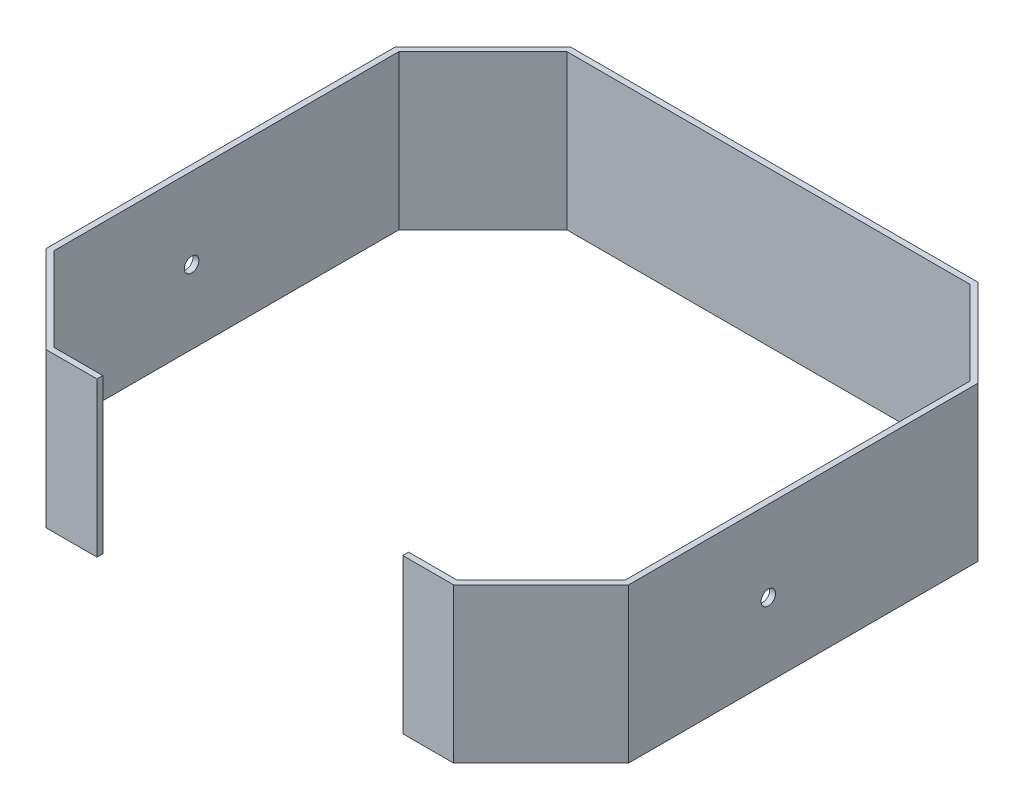
ISO-10303-21;
HEADER;
FILE_DESCRIPTION(('STEP AP214'),'2;1');
FILE_NAME('part.step','',(''),(''),'','','');
FILE_SCHEMA(('AUTOMOTIVE_DESIGN { 1 0 10303 214 1 1 1 1 }'));
ENDSEC;
DATA;
#1=APPLICATION_CONTEXT('core data for automotive mechanical design processes');
#2=APPLICATION_PROTOCOL_DEFINITION('international standard','automotive_design',2000,#1);
#3=PRODUCT_CONTEXT('',#1,'mechanical');
#4=PRODUCT('Part','Part','',(#3));
#5=PRODUCT_RELATED_PRODUCT_CATEGORY('part','',(#4));
#6=PRODUCT_DEFINITION_FORMATION('','',#4);
#7=PRODUCT_DEFINITION_CONTEXT('part definition',#1,'design');
#8=PRODUCT_DEFINITION('design','',#6,#7);
#9=PRODUCT_DEFINITION_SHAPE('','',#8);
#10=(LENGTH_UNIT() NAMED_UNIT(*) SI_UNIT(.MILLI.,.METRE.));
#11=(NAMED_UNIT(*) PLANE_ANGLE_UNIT() SI_UNIT($,.RADIAN.));
#12=(NAMED_UNIT(*) SI_UNIT($,.STERADIAN.) SOLID_ANGLE_UNIT());
#13=UNCERTAINTY_MEASURE_WITH_UNIT(LENGTH_MEASURE(1.E-05),#10,'distance_accuracy_value','');
#14=(GEOMETRIC_REPRESENTATION_CONTEXT(3) GLOBAL_UNCERTAINTY_ASSIGNED_CONTEXT((#13)) GLOBAL_UNIT_ASSIGNED_CONTEXT((#10,
#11,#12)) REPRESENTATION_CONTEXT('',''));
#15=CARTESIAN_POINT('',(0.,0.,0.));
#16=DIRECTION('',(0.,0.,1.));
#17=DIRECTION('',(1.,0.,0.));
#18=AXIS2_PLACEMENT_3D('',#15,#16,#17);
#19=CARTESIAN_POINT('',(-100.,26.5,90.));
#20=DIRECTION('',(0.,0.,-1.));
#21=DIRECTION('',(-1.,0.,0.));
#22=AXIS2_PLACEMENT_3D('',#19,#20,#21);
#23=PLANE('',#22);
#24=DIRECTION('',(1.,0.,0.));
#25=VECTOR('',#24,1.);
#26=CARTESIAN_POINT('',(-100.,-26.5,90.));
#27=LINE('',#26,#25);
#28=CARTESIAN_POINT('',(-70.,-26.5,90.));
#29=VERTEX_POINT('',#28);
#30=CARTESIAN_POINT('',(-52.5,-26.5,90.));
#31=VERTEX_POINT('',#30);
#32=EDGE_CURVE('E218',#29,#31,#27,.T.);
#33=ORIENTED_EDGE('',*,*,#32,.T.);
#34=DIRECTION('',(0.,-1.,0.));
#35=VECTOR('',#34,1.);
#36=CARTESIAN_POINT('',(-52.5,-26.5,90.));
#37=LINE('',#36,#35);
#38=CARTESIAN_POINT('',(-52.5,26.5,90.));
#39=VERTEX_POINT('',#38);
#40=EDGE_CURVE('E195',#39,#31,#37,.T.);
#41=ORIENTED_EDGE('',*,*,#40,.F.);
#42=DIRECTION('',(1.,0.,0.));
#43=VECTOR('',#42,1.);
#44=CARTESIAN_POINT('',(-100.,26.5,90.));
#45=LINE('',#44,#43);
#46=CARTESIAN_POINT('',(-70.,26.5,90.));
#47=VERTEX_POINT('',#46);
#48=EDGE_CURVE('E194',#47,#39,#45,.T.);
#49=ORIENTED_EDGE('',*,*,#48,.F.);
#50=DIRECTION('',(0.,-1.,0.));
#51=VECTOR('',#50,1.);
#52=CARTESIAN_POINT('',(-70.,26.5,90.));
#53=LINE('',#52,#51);
#54=EDGE_CURVE('E52',#47,#29,#53,.T.);
#55=ORIENTED_EDGE('',*,*,#54,.T.);
#56=EDGE_LOOP('',(#33,#41,#49,#55));
#57=FACE_BOUND('',#56,.T.);
#58=ADVANCED_FACE('F43',(#57),#23,.F.);
#59=CARTESIAN_POINT('',(-100.,26.5,88.));
#60=DIRECTION('',(0.,0.,-1.));
#61=DIRECTION('',(-1.,0.,0.));
#62=AXIS2_PLACEMENT_3D('',#59,#60,#61);
#63=PLANE('',#62);
#64=DIRECTION('',(0.,-1.,0.));
#65=VECTOR('',#64,1.);
#66=CARTESIAN_POINT('',(-52.5,-26.5,88.));
#67=LINE('',#66,#65);
#68=CARTESIAN_POINT('',(-52.5,26.5,88.));
#69=VERTEX_POINT('',#68);
#70=CARTESIAN_POINT('',(-52.5,-26.5,88.));
#71=VERTEX_POINT('',#70);
#72=EDGE_CURVE('E178',#69,#71,#67,.T.);
#73=ORIENTED_EDGE('',*,*,#72,.T.);
#74=DIRECTION('',(1.,0.,0.));
#75=VECTOR('',#74,1.);
#76=CARTESIAN_POINT('',(0.,-26.5,88.));
#77=LINE('',#76,#75);
#78=CARTESIAN_POINT('',(-69.1715728752538,-26.5,88.));
#79=VERTEX_POINT('',#78);
#80=EDGE_CURVE('E280',#79,#71,#77,.T.);
#81=ORIENTED_EDGE('',*,*,#80,.F.);
#82=DIRECTION('',(0.,1.,0.));
#83=VECTOR('',#82,1.);
#84=CARTESIAN_POINT('',(-69.1715728752538,26.5,88.));
#85=LINE('',#84,#83);
#86=CARTESIAN_POINT('',(-69.1715728752538,26.5,88.));
#87=VERTEX_POINT('',#86);
#88=EDGE_CURVE('E200',#87,#79,#85,.F.);
#89=ORIENTED_EDGE('',*,*,#88,.F.);
#90=DIRECTION('',(1.,0.,0.));
#91=VECTOR('',#90,1.);
#92=CARTESIAN_POINT('',(0.,26.5,88.));
#93=LINE('',#92,#91);
#94=EDGE_CURVE('E192',#87,#69,#93,.T.);
#95=ORIENTED_EDGE('',*,*,#94,.T.);
#96=EDGE_LOOP('',(#73,#81,#89,#95));
#97=FACE_BOUND('',#96,.T.);
#98=ADVANCED_FACE('F198',(#97),#63,.T.);
#99=CARTESIAN_POINT('',(0.,26.5,0.));
#100=DIRECTION('',(0.,-1.,0.));
#101=DIRECTION('',(0.,0.,-1.));
#102=AXIS2_PLACEMENT_3D('',#99,#100,#101);
#103=PLANE('',#102);
#104=ORIENTED_EDGE('',*,*,#48,.T.);
#105=DIRECTION('',(0.,0.,1.));
#106=VECTOR('',#105,1.);
#107=CARTESIAN_POINT('',(-52.5,26.5,-29.618025829377));
#108=LINE('',#107,#106);
#109=EDGE_CURVE('E181',#69,#39,#108,.T.);
#110=ORIENTED_EDGE('',*,*,#109,.F.);
#111=ORIENTED_EDGE('',*,*,#94,.F.);
#112=DIRECTION('',(-0.707106781186546,0.,-0.707106781186549));
#113=VECTOR('',#112,1.);
#114=CARTESIAN_POINT('',(-68.5857864376269,26.5,88.5857864376269));
#115=LINE('',#114,#113);
#116=CARTESIAN_POINT('',(-98.,26.5,59.1715728752537));
#117=VERTEX_POINT('',#116);
#118=EDGE_CURVE('E209',#117,#87,#115,.F.);
#119=ORIENTED_EDGE('',*,*,#118,.F.);
#120=DIRECTION('',(0.,0.,1.));
#121=VECTOR('',#120,1.);
#122=CARTESIAN_POINT('',(-98.,26.5,0.));
#123=LINE('',#122,#121);
#124=CARTESIAN_POINT('',(-98.,26.5,-59.1715728752538));
#125=VERTEX_POINT('',#124);
#126=EDGE_CURVE('E206',#125,#117,#123,.T.);
#127=ORIENTED_EDGE('',*,*,#126,.F.);
#128=DIRECTION('',(0.707106781186549,0.,-0.707106781186546));
#129=VECTOR('',#128,1.);
#130=CARTESIAN_POINT('',(-98.5857864376269,26.5,-58.5857864376269));
#131=LINE('',#130,#129);
#132=CARTESIAN_POINT('',(-69.1715728752538,26.5,-88.));
#133=VERTEX_POINT('',#132);
#134=EDGE_CURVE('E293',#133,#125,#131,.F.);
#135=ORIENTED_EDGE('',*,*,#134,.F.);
#136=DIRECTION('',(-1.,0.,0.));
#137=VECTOR('',#136,1.);
#138=CARTESIAN_POINT('',(0.,26.5,-88.));
#139=LINE('',#138,#137);
#140=CARTESIAN_POINT('',(69.1715728752538,26.5,-88.));
#141=VERTEX_POINT('',#140);
#142=EDGE_CURVE('E323',#141,#133,#139,.T.);
#143=ORIENTED_EDGE('',*,*,#142,.F.);
#144=DIRECTION('',(0.707106781186546,0.,0.707106781186549));
#145=VECTOR('',#144,1.);
#146=CARTESIAN_POINT('',(68.5857864376269,26.5,-88.5857864376269));
#147=LINE('',#146,#145);
#148=CARTESIAN_POINT('',(98.,26.5,-59.1715728752537));
#149=VERTEX_POINT('',#148);
#150=EDGE_CURVE('E213',#149,#141,#147,.F.);
#151=ORIENTED_EDGE('',*,*,#150,.F.);
#152=DIRECTION('',(0.,0.,-1.));
#153=VECTOR('',#152,1.);
#154=CARTESIAN_POINT('',(98.,26.5,0.));
#155=LINE('',#154,#153);
#156=CARTESIAN_POINT('',(98.,26.5,59.1715728752538));
#157=VERTEX_POINT('',#156);
#158=EDGE_CURVE('E312',#157,#149,#155,.T.);
#159=ORIENTED_EDGE('',*,*,#158,.F.);
#160=DIRECTION('',(-0.707106781186549,0.,0.707106781186546));
#161=VECTOR('',#160,1.);
#162=CARTESIAN_POINT('',(98.5857864376269,26.5,58.5857864376269));
#163=LINE('',#162,#161);
#164=CARTESIAN_POINT('',(69.1715728752537,26.5,88.));
#165=VERTEX_POINT('',#164);
#166=EDGE_CURVE('E211',#165,#157,#163,.F.);
#167=ORIENTED_EDGE('',*,*,#166,.F.);
#168=CARTESIAN_POINT('',(52.5,26.5,88.));
#169=VERTEX_POINT('',#168);
#170=EDGE_CURVE('E202',#169,#165,#93,.T.);
#171=ORIENTED_EDGE('',*,*,#170,.F.);
#172=DIRECTION('',(0.,0.,1.));
#173=VECTOR('',#172,1.);
#174=CARTESIAN_POINT('',(52.5,26.5,-29.618025829377));
#175=LINE('',#174,#173);
#176=CARTESIAN_POINT('',(52.5,26.5,90.));
#177=VERTEX_POINT('',#176);
#178=EDGE_CURVE('E59',#169,#177,#175,.T.);
#179=ORIENTED_EDGE('',*,*,#178,.T.);
#180=CARTESIAN_POINT('',(69.9999999999999,26.5,90.));
#181=VERTEX_POINT('',#180);
#182=EDGE_CURVE('E224',#177,#181,#45,.T.);
#183=ORIENTED_EDGE('',*,*,#182,.T.);
#184=DIRECTION('',(-0.707106781186549,0.,0.707106781186546));
#185=VECTOR('',#184,1.);
#186=CARTESIAN_POINT('',(100.,26.5,60.));
#187=LINE('',#186,#185);
#188=CARTESIAN_POINT('',(100.,26.5,60.));
#189=VERTEX_POINT('',#188);
#190=EDGE_CURVE('E260',#181,#189,#187,.F.);
#191=ORIENTED_EDGE('',*,*,#190,.T.);
#192=DIRECTION('',(0.,0.,-1.));
#193=VECTOR('',#192,1.);
#194=CARTESIAN_POINT('',(100.,26.5,90.));
#195=LINE('',#194,#193);
#196=CARTESIAN_POINT('',(100.,26.5,-59.9999999999998));
#197=VERTEX_POINT('',#196);
#198=EDGE_CURVE('E214',#189,#197,#195,.T.);
#199=ORIENTED_EDGE('',*,*,#198,.T.);
#200=DIRECTION('',(0.707106781186546,0.,0.707106781186549));
#201=VECTOR('',#200,1.);
#202=CARTESIAN_POINT('',(70.,26.5,-90.));
#203=LINE('',#202,#201);
#204=CARTESIAN_POINT('',(70.,26.5,-90.));
#205=VERTEX_POINT('',#204);
#206=EDGE_CURVE('E262',#197,#205,#203,.F.);
#207=ORIENTED_EDGE('',*,*,#206,.T.);
#208=DIRECTION('',(-1.,0.,0.));
#209=VECTOR('',#208,1.);
#210=CARTESIAN_POINT('',(-100.,26.5,-90.));
#211=LINE('',#210,#209);
#212=CARTESIAN_POINT('',(-69.9999999999999,26.5,-90.));
#213=VERTEX_POINT('',#212);
#214=EDGE_CURVE('E217',#205,#213,#211,.T.);
#215=ORIENTED_EDGE('',*,*,#214,.T.);
#216=DIRECTION('',(0.707106781186549,0.,-0.707106781186546));
#217=VECTOR('',#216,1.);
#218=CARTESIAN_POINT('',(-100.,26.5,-60.));
#219=LINE('',#218,#217);
#220=CARTESIAN_POINT('',(-100.,26.5,-60.));
#221=VERTEX_POINT('',#220);
#222=EDGE_CURVE('E264',#213,#221,#219,.F.);
#223=ORIENTED_EDGE('',*,*,#222,.T.);
#224=DIRECTION('',(0.,0.,1.));
#225=VECTOR('',#224,1.);
#226=CARTESIAN_POINT('',(-100.,26.5,90.));
#227=LINE('',#226,#225);
#228=CARTESIAN_POINT('',(-100.,26.5,59.9999999999999));
#229=VERTEX_POINT('',#228);
#230=EDGE_CURVE('E221',#221,#229,#227,.T.);
#231=ORIENTED_EDGE('',*,*,#230,.T.);
#232=DIRECTION('',(-0.707106781186546,0.,-0.707106781186549));
#233=VECTOR('',#232,1.);
#234=CARTESIAN_POINT('',(-70.,26.5,90.));
#235=LINE('',#234,#233);
#236=EDGE_CURVE('E258',#229,#47,#235,.F.);
#237=ORIENTED_EDGE('',*,*,#236,.T.);
#238=EDGE_LOOP('',(#104,#110,#111,#119,#127,#135,#143,#151,#159,#167,#171,#179,#183,#191,#199,
#207,#215,#223,#231,#237));
#239=FACE_BOUND('',#238,.T.);
#240=ADVANCED_FACE('F190',(#239),#103,.F.);
#241=CARTESIAN_POINT('',(0.,-26.5,0.));
#242=DIRECTION('',(0.,-1.,0.));
#243=DIRECTION('',(0.,0.,-1.));
#244=AXIS2_PLACEMENT_3D('',#241,#242,#243);
#245=PLANE('',#244);
#246=DIRECTION('',(0.,0.,1.));
#247=VECTOR('',#246,1.);
#248=CARTESIAN_POINT('',(-52.5,-26.5,-29.618025829377));
#249=LINE('',#248,#247);
#250=EDGE_CURVE('E67',#71,#31,#249,.T.);
#251=ORIENTED_EDGE('',*,*,#250,.T.);
#252=ORIENTED_EDGE('',*,*,#32,.F.);
#253=DIRECTION('',(0.707106781186546,0.,0.707106781186549));
#254=VECTOR('',#253,1.);
#255=CARTESIAN_POINT('',(-80.0000000000002,-26.5,79.9999999999998));
#256=LINE('',#255,#254);
#257=CARTESIAN_POINT('',(-100.,-26.5,59.9999999999999));
#258=VERTEX_POINT('',#257);
#259=EDGE_CURVE('E244',#29,#258,#256,.F.);
#260=ORIENTED_EDGE('',*,*,#259,.T.);
#261=DIRECTION('',(0.,0.,1.));
#262=VECTOR('',#261,1.);
#263=CARTESIAN_POINT('',(-100.,-26.5,90.));
#264=LINE('',#263,#262);
#265=CARTESIAN_POINT('',(-100.,-26.5,-60.));
#266=VERTEX_POINT('',#265);
#267=EDGE_CURVE('E234',#266,#258,#264,.T.);
#268=ORIENTED_EDGE('',*,*,#267,.F.);
#269=DIRECTION('',(-0.707106781186549,0.,0.707106781186546));
#270=VECTOR('',#269,1.);
#271=CARTESIAN_POINT('',(-79.9999999999998,-26.5,-80.0000000000001));
#272=LINE('',#271,#270);
#273=CARTESIAN_POINT('',(-69.9999999999999,-26.5,-90.));
#274=VERTEX_POINT('',#273);
#275=EDGE_CURVE('E251',#266,#274,#272,.F.);
#276=ORIENTED_EDGE('',*,*,#275,.T.);
#277=DIRECTION('',(-1.,0.,0.));
#278=VECTOR('',#277,1.);
#279=CARTESIAN_POINT('',(-100.,-26.5,-90.));
#280=LINE('',#279,#278);
#281=CARTESIAN_POINT('',(70.,-26.5,-90.));
#282=VERTEX_POINT('',#281);
#283=EDGE_CURVE('E230',#282,#274,#280,.T.);
#284=ORIENTED_EDGE('',*,*,#283,.F.);
#285=DIRECTION('',(-0.707106781186546,0.,-0.707106781186549));
#286=VECTOR('',#285,1.);
#287=CARTESIAN_POINT('',(80.0000000000002,-26.5,-79.9999999999998));
#288=LINE('',#287,#286);
#289=CARTESIAN_POINT('',(100.,-26.5,-59.9999999999998));
#290=VERTEX_POINT('',#289);
#291=EDGE_CURVE('E249',#282,#290,#288,.F.);
#292=ORIENTED_EDGE('',*,*,#291,.T.);
#293=DIRECTION('',(0.,0.,-1.));
#294=VECTOR('',#293,1.);
#295=CARTESIAN_POINT('',(100.,-26.5,90.));
#296=LINE('',#295,#294);
#297=CARTESIAN_POINT('',(100.,-26.5,60.));
#298=VERTEX_POINT('',#297);
#299=EDGE_CURVE('E227',#298,#290,#296,.T.);
#300=ORIENTED_EDGE('',*,*,#299,.F.);
#301=DIRECTION('',(0.707106781186549,0.,-0.707106781186546));
#302=VECTOR('',#301,1.);
#303=CARTESIAN_POINT('',(79.9999999999998,-26.5,80.0000000000001));
#304=LINE('',#303,#302);
#305=CARTESIAN_POINT('',(69.9999999999999,-26.5,90.));
#306=VERTEX_POINT('',#305);
#307=EDGE_CURVE('E246',#298,#306,#304,.F.);
#308=ORIENTED_EDGE('',*,*,#307,.T.);
#309=CARTESIAN_POINT('',(52.5,-26.5,90.));
#310=VERTEX_POINT('',#309);
#311=EDGE_CURVE('E237',#310,#306,#27,.T.);
#312=ORIENTED_EDGE('',*,*,#311,.F.);
#313=DIRECTION('',(0.,0.,1.));
#314=VECTOR('',#313,1.);
#315=CARTESIAN_POINT('',(52.5,-26.5,-29.618025829377));
#316=LINE('',#315,#314);
#317=CARTESIAN_POINT('',(52.5,-26.5,88.));
#318=VERTEX_POINT('',#317);
#319=EDGE_CURVE('E281',#318,#310,#316,.T.);
#320=ORIENTED_EDGE('',*,*,#319,.F.);
#321=CARTESIAN_POINT('',(69.1715728752537,-26.5,88.));
#322=VERTEX_POINT('',#321);
#323=EDGE_CURVE('E313',#318,#322,#77,.T.);
#324=ORIENTED_EDGE('',*,*,#323,.T.);
#325=DIRECTION('',(0.707106781186549,0.,-0.707106781186546));
#326=VECTOR('',#325,1.);
#327=CARTESIAN_POINT('',(78.5857864376267,-26.5,78.585786437627));
#328=LINE('',#327,#326);
#329=CARTESIAN_POINT('',(98.,-26.5,59.1715728752538));
#330=VERTEX_POINT('',#329);
#331=EDGE_CURVE('E307',#330,#322,#328,.F.);
#332=ORIENTED_EDGE('',*,*,#331,.F.);
#333=DIRECTION('',(0.,0.,-1.));
#334=VECTOR('',#333,1.);
#335=CARTESIAN_POINT('',(98.,-26.5,0.));
#336=LINE('',#335,#334);
#337=CARTESIAN_POINT('',(98.,-26.5,-59.1715728752537));
#338=VERTEX_POINT('',#337);
#339=EDGE_CURVE('E287',#330,#338,#336,.T.);
#340=ORIENTED_EDGE('',*,*,#339,.T.);
#341=DIRECTION('',(-0.707106781186546,0.,-0.707106781186549));
#342=VECTOR('',#341,1.);
#343=CARTESIAN_POINT('',(78.585786437627,-26.5,-78.5857864376267));
#344=LINE('',#343,#342);
#345=CARTESIAN_POINT('',(69.1715728752538,-26.5,-88.));
#346=VERTEX_POINT('',#345);
#347=EDGE_CURVE('E310',#346,#338,#344,.F.);
#348=ORIENTED_EDGE('',*,*,#347,.F.);
#349=DIRECTION('',(-1.,0.,0.));
#350=VECTOR('',#349,1.);
#351=CARTESIAN_POINT('',(0.,-26.5,-88.));
#352=LINE('',#351,#350);
#353=CARTESIAN_POINT('',(-69.1715728752538,-26.5,-88.));
#354=VERTEX_POINT('',#353);
#355=EDGE_CURVE('E306',#346,#354,#352,.T.);
#356=ORIENTED_EDGE('',*,*,#355,.T.);
#357=DIRECTION('',(-0.707106781186549,0.,0.707106781186546));
#358=VECTOR('',#357,1.);
#359=CARTESIAN_POINT('',(-78.5857864376268,-26.5,-78.585786437627));
#360=LINE('',#359,#358);
#361=CARTESIAN_POINT('',(-98.,-26.5,-59.1715728752538));
#362=VERTEX_POINT('',#361);
#363=EDGE_CURVE('E297',#362,#354,#360,.F.);
#364=ORIENTED_EDGE('',*,*,#363,.F.);
#365=DIRECTION('',(0.,0.,1.));
#366=VECTOR('',#365,1.);
#367=CARTESIAN_POINT('',(-98.,-26.5,0.));
#368=LINE('',#367,#366);
#369=CARTESIAN_POINT('',(-98.,-26.5,59.1715728752537));
#370=VERTEX_POINT('',#369);
#371=EDGE_CURVE('E315',#362,#370,#368,.T.);
#372=ORIENTED_EDGE('',*,*,#371,.T.);
#373=DIRECTION('',(0.707106781186546,0.,0.707106781186549));
#374=VECTOR('',#373,1.);
#375=CARTESIAN_POINT('',(-78.5857864376271,-26.5,78.5857864376267));
#376=LINE('',#375,#374);
#377=EDGE_CURVE('E299',#79,#370,#376,.F.);
#378=ORIENTED_EDGE('',*,*,#377,.F.);
#379=ORIENTED_EDGE('',*,*,#80,.T.);
#380=EDGE_LOOP('',(#251,#252,#260,#268,#276,#284,#292,#300,#308,#312,#320,#324,#332,#340,#348,
#356,#364,#372,#378,#379));
#381=FACE_BOUND('',#380,.T.);
#382=ADVANCED_FACE('F277',(#381),#245,.T.);
#383=CARTESIAN_POINT('',(100.,26.5,90.));
#384=DIRECTION('',(-1.,0.,0.));
#385=DIRECTION('',(0.,0.,1.));
#386=AXIS2_PLACEMENT_3D('',#383,#384,#385);
#387=PLANE('',#386);
#388=CARTESIAN_POINT('',(100.,-1.24999999999996,12.));
#389=DIRECTION('',(-1.,0.,0.));
#390=DIRECTION('',(0.,0.,1.));
#391=AXIS2_PLACEMENT_3D('',#388,#389,#390);
#392=CIRCLE('',#391,2.5);
#393=CARTESIAN_POINT('',(100.,-1.24999999999996,14.5));
#394=VERTEX_POINT('',#393);
#395=EDGE_CURVE('E708',#394,#394,#392,.F.);
#396=ORIENTED_EDGE('',*,*,#395,.F.);
#397=EDGE_LOOP('',(#396));
#398=FACE_BOUND('',#397,.T.);
#399=ORIENTED_EDGE('',*,*,#299,.T.);
#400=DIRECTION('',(0.,1.,0.));
#401=VECTOR('',#400,1.);
#402=CARTESIAN_POINT('',(100.,26.5,-59.9999999999999));
#403=LINE('',#402,#401);
#404=EDGE_CURVE('E269',#290,#197,#403,.T.);
#405=ORIENTED_EDGE('',*,*,#404,.T.);
#406=ORIENTED_EDGE('',*,*,#198,.F.);
#407=DIRECTION('',(0.,-1.,0.));
#408=VECTOR('',#407,1.);
#409=CARTESIAN_POINT('',(100.,26.5,60.));
#410=LINE('',#409,#408);
#411=EDGE_CURVE('E266',#189,#298,#410,.T.);
#412=ORIENTED_EDGE('',*,*,#411,.T.);
#413=EDGE_LOOP('',(#399,#405,#406,#412));
#414=FACE_BOUND('',#413,.T.);
#415=ADVANCED_FACE('F382',(#398,#414),#387,.F.);
#416=CARTESIAN_POINT('',(-100.,26.5,-90.));
#417=DIRECTION('',(0.,0.,1.));
#418=DIRECTION('',(1.,0.,0.));
#419=AXIS2_PLACEMENT_3D('',#416,#417,#418);
#420=PLANE('',#419);
#421=ORIENTED_EDGE('',*,*,#283,.T.);
#422=DIRECTION('',(0.,1.,0.));
#423=VECTOR('',#422,1.);
#424=CARTESIAN_POINT('',(-69.9999999999999,26.5,-90.));
#425=LINE('',#424,#423);
#426=EDGE_CURVE('E256',#274,#213,#425,.T.);
#427=ORIENTED_EDGE('',*,*,#426,.T.);
#428=ORIENTED_EDGE('',*,*,#214,.F.);
#429=DIRECTION('',(0.,-1.,0.));
#430=VECTOR('',#429,1.);
#431=CARTESIAN_POINT('',(70.,26.5,-90.));
#432=LINE('',#431,#430);
#433=EDGE_CURVE('E253',#205,#282,#432,.T.);
#434=ORIENTED_EDGE('',*,*,#433,.T.);
#435=EDGE_LOOP('',(#421,#427,#428,#434));
#436=FACE_BOUND('',#435,.T.);
#437=ADVANCED_FACE('F391',(#436),#420,.F.);
#438=CARTESIAN_POINT('',(-100.,26.5,90.));
#439=DIRECTION('',(1.,0.,0.));
#440=DIRECTION('',(0.,0.,-1.));
#441=AXIS2_PLACEMENT_3D('',#438,#439,#440);
#442=PLANE('',#441);
#443=CARTESIAN_POINT('',(-100.,-1.24999999999997,12.));
#444=DIRECTION('',(1.,0.,0.));
#445=DIRECTION('',(0.,0.,-1.));
#446=AXIS2_PLACEMENT_3D('',#443,#444,#445);
#447=CIRCLE('',#446,2.5);
#448=CARTESIAN_POINT('',(-100.,-1.24999999999997,9.50000000000003));
#449=VERTEX_POINT('',#448);
#450=EDGE_CURVE('E709',#449,#449,#447,.F.);
#451=ORIENTED_EDGE('',*,*,#450,.F.);
#452=EDGE_LOOP('',(#451));
#453=FACE_BOUND('',#452,.T.);
#454=ORIENTED_EDGE('',*,*,#230,.F.);
#455=DIRECTION('',(0.,-1.,0.));
#456=VECTOR('',#455,1.);
#457=CARTESIAN_POINT('',(-100.,26.5,-60.));
#458=LINE('',#457,#456);
#459=EDGE_CURVE('E241',#221,#266,#458,.T.);
#460=ORIENTED_EDGE('',*,*,#459,.T.);
#461=ORIENTED_EDGE('',*,*,#267,.T.);
#462=DIRECTION('',(0.,1.,0.));
#463=VECTOR('',#462,1.);
#464=CARTESIAN_POINT('',(-100.,26.5,59.9999999999999));
#465=LINE('',#464,#463);
#466=EDGE_CURVE('E226',#258,#229,#465,.T.);
#467=ORIENTED_EDGE('',*,*,#466,.T.);
#468=EDGE_LOOP('',(#454,#460,#461,#467));
#469=FACE_BOUND('',#468,.T.);
#470=ADVANCED_FACE('F399',(#453,#469),#442,.F.);
#471=ORIENTED_EDGE('',*,*,#182,.F.);
#472=DIRECTION('',(0.,1.,0.));
#473=VECTOR('',#472,1.);
#474=CARTESIAN_POINT('',(52.5,-26.5,90.));
#475=LINE('',#474,#473);
#476=EDGE_CURVE('E372',#310,#177,#475,.T.);
#477=ORIENTED_EDGE('',*,*,#476,.F.);
#478=ORIENTED_EDGE('',*,*,#311,.T.);
#479=DIRECTION('',(0.,1.,0.));
#480=VECTOR('',#479,1.);
#481=CARTESIAN_POINT('',(69.9999999999999,26.5,90.));
#482=LINE('',#481,#480);
#483=EDGE_CURVE('E11',#306,#181,#482,.T.);
#484=ORIENTED_EDGE('',*,*,#483,.T.);
#485=EDGE_LOOP('',(#471,#477,#478,#484));
#486=FACE_BOUND('',#485,.T.);
#487=ADVANCED_FACE('F371',(#486),#23,.F.);
#488=CARTESIAN_POINT('',(-100.,26.5,-60.));
#489=DIRECTION('',(0.707106781186546,0.,0.707106781186549));
#490=DIRECTION('',(0.,-1.,0.));
#491=AXIS2_PLACEMENT_3D('',#488,#489,#490);
#492=PLANE('',#491);
#493=ORIENTED_EDGE('',*,*,#222,.F.);
#494=ORIENTED_EDGE('',*,*,#426,.F.);
#495=ORIENTED_EDGE('',*,*,#275,.F.);
#496=ORIENTED_EDGE('',*,*,#459,.F.);
#497=EDGE_LOOP('',(#493,#494,#495,#496));
#498=FACE_BOUND('',#497,.T.);
#499=ADVANCED_FACE('F395',(#498),#492,.F.);
#500=CARTESIAN_POINT('',(70.,26.5,-90.));
#501=DIRECTION('',(-0.707106781186549,0.,0.707106781186546));
#502=DIRECTION('',(0.,-1.,0.));
#503=AXIS2_PLACEMENT_3D('',#500,#501,#502);
#504=PLANE('',#503);
#505=ORIENTED_EDGE('',*,*,#206,.F.);
#506=ORIENTED_EDGE('',*,*,#404,.F.);
#507=ORIENTED_EDGE('',*,*,#291,.F.);
#508=ORIENTED_EDGE('',*,*,#433,.F.);
#509=EDGE_LOOP('',(#505,#506,#507,#508));
#510=FACE_BOUND('',#509,.T.);
#511=ADVANCED_FACE('F386',(#510),#504,.F.);
#512=CARTESIAN_POINT('',(100.,26.5,60.));
#513=DIRECTION('',(-0.707106781186546,0.,-0.707106781186549));
#514=DIRECTION('',(0.,-1.,0.));
#515=AXIS2_PLACEMENT_3D('',#512,#513,#514);
#516=PLANE('',#515);
#517=ORIENTED_EDGE('',*,*,#190,.F.);
#518=ORIENTED_EDGE('',*,*,#483,.F.);
#519=ORIENTED_EDGE('',*,*,#307,.F.);
#520=ORIENTED_EDGE('',*,*,#411,.F.);
#521=EDGE_LOOP('',(#517,#518,#519,#520));
#522=FACE_BOUND('',#521,.T.);
#523=ADVANCED_FACE('F378',(#522),#516,.F.);
#524=CARTESIAN_POINT('',(-70.,26.5,90.));
#525=DIRECTION('',(0.707106781186549,0.,-0.707106781186546));
#526=DIRECTION('',(0.,-1.,0.));
#527=AXIS2_PLACEMENT_3D('',#524,#525,#526);
#528=PLANE('',#527);
#529=ORIENTED_EDGE('',*,*,#236,.F.);
#530=ORIENTED_EDGE('',*,*,#466,.F.);
#531=ORIENTED_EDGE('',*,*,#259,.F.);
#532=ORIENTED_EDGE('',*,*,#54,.F.);
#533=EDGE_LOOP('',(#529,#530,#531,#532));
#534=FACE_BOUND('',#533,.T.);
#535=ADVANCED_FACE('F46',(#534),#528,.F.);
#536=CARTESIAN_POINT('',(98.,26.5,90.));
#537=DIRECTION('',(-1.,0.,0.));
#538=DIRECTION('',(0.,0.,1.));
#539=AXIS2_PLACEMENT_3D('',#536,#537,#538);
#540=PLANE('',#539);
#541=ORIENTED_EDGE('',*,*,#339,.F.);
#542=DIRECTION('',(0.,1.,0.));
#543=VECTOR('',#542,1.);
#544=CARTESIAN_POINT('',(98.,26.5,59.1715728752538));
#545=LINE('',#544,#543);
#546=EDGE_CURVE('E291',#157,#330,#545,.F.);
#547=ORIENTED_EDGE('',*,*,#546,.F.);
#548=ORIENTED_EDGE('',*,*,#158,.T.);
#549=DIRECTION('',(0.,-1.,0.));
#550=VECTOR('',#549,1.);
#551=CARTESIAN_POINT('',(98.,26.5,-59.1715728752537));
#552=LINE('',#551,#550);
#553=EDGE_CURVE('E288',#338,#149,#552,.F.);
#554=ORIENTED_EDGE('',*,*,#553,.F.);
#555=EDGE_LOOP('',(#541,#547,#548,#554));
#556=FACE_BOUND('',#555,.T.);
#557=CARTESIAN_POINT('',(98.,-1.24999999999996,12.));
#558=DIRECTION('',(-1.,0.,0.));
#559=DIRECTION('',(0.,-0.962990008591032,-0.269537090868482));
#560=AXIS2_PLACEMENT_3D('',#557,#558,#559);
#561=CIRCLE('',#560,2.5);
#562=CARTESIAN_POINT('',(98.,-3.65747502147754,11.3261572728288));
#563=VERTEX_POINT('',#562);
#564=EDGE_CURVE('E705',#563,#563,#561,.F.);
#565=ORIENTED_EDGE('',*,*,#564,.T.);
#566=EDGE_LOOP('',(#565));
#567=FACE_BOUND('',#566,.T.);
#568=ADVANCED_FACE('F356',(#556,#567),#540,.T.);
#569=CARTESIAN_POINT('',(-100.,26.5,-88.));
#570=DIRECTION('',(0.,0.,1.));
#571=DIRECTION('',(1.,0.,0.));
#572=AXIS2_PLACEMENT_3D('',#569,#570,#571);
#573=PLANE('',#572);
#574=ORIENTED_EDGE('',*,*,#355,.F.);
#575=DIRECTION('',(0.,1.,0.));
#576=VECTOR('',#575,1.);
#577=CARTESIAN_POINT('',(69.1715728752538,26.5,-88.));
#578=LINE('',#577,#576);
#579=EDGE_CURVE('E294',#141,#346,#578,.F.);
#580=ORIENTED_EDGE('',*,*,#579,.F.);
#581=ORIENTED_EDGE('',*,*,#142,.T.);
#582=DIRECTION('',(0.,-1.,0.));
#583=VECTOR('',#582,1.);
#584=CARTESIAN_POINT('',(-69.1715728752538,26.5,-88.));
#585=LINE('',#584,#583);
#586=EDGE_CURVE('E296',#354,#133,#585,.F.);
#587=ORIENTED_EDGE('',*,*,#586,.F.);
#588=EDGE_LOOP('',(#574,#580,#581,#587));
#589=FACE_BOUND('',#588,.T.);
#590=ADVANCED_FACE('F345',(#589),#573,.T.);
#591=CARTESIAN_POINT('',(-98.,26.5,90.));
#592=DIRECTION('',(1.,0.,0.));
#593=DIRECTION('',(0.,0.,-1.));
#594=AXIS2_PLACEMENT_3D('',#591,#592,#593);
#595=PLANE('',#594);
#596=ORIENTED_EDGE('',*,*,#126,.T.);
#597=DIRECTION('',(0.,-1.,0.));
#598=VECTOR('',#597,1.);
#599=CARTESIAN_POINT('',(-98.,26.5,59.1715728752537));
#600=LINE('',#599,#598);
#601=EDGE_CURVE('E201',#370,#117,#600,.F.);
#602=ORIENTED_EDGE('',*,*,#601,.F.);
#603=ORIENTED_EDGE('',*,*,#371,.F.);
#604=DIRECTION('',(0.,1.,0.));
#605=VECTOR('',#604,1.);
#606=CARTESIAN_POINT('',(-98.,26.5,-59.1715728752538));
#607=LINE('',#606,#605);
#608=EDGE_CURVE('E204',#125,#362,#607,.F.);
#609=ORIENTED_EDGE('',*,*,#608,.F.);
#610=EDGE_LOOP('',(#596,#602,#603,#609));
#611=FACE_BOUND('',#610,.T.);
#612=CARTESIAN_POINT('',(-98.,-1.24999999999997,12.));
#613=DIRECTION('',(1.,0.,0.));
#614=DIRECTION('',(0.,-0.667938598394417,-0.744216385720512));
#615=AXIS2_PLACEMENT_3D('',#612,#613,#614);
#616=CIRCLE('',#615,2.5);
#617=CARTESIAN_POINT('',(-98.,-2.91984649598601,10.1394590356987));
#618=VERTEX_POINT('',#617);
#619=EDGE_CURVE('E713',#618,#618,#616,.F.);
#620=ORIENTED_EDGE('',*,*,#619,.T.);
#621=EDGE_LOOP('',(#620));
#622=FACE_BOUND('',#621,.T.);
#623=ADVANCED_FACE('F332',(#611,#622),#595,.T.);
#624=DIRECTION('',(0.,1.,0.));
#625=VECTOR('',#624,1.);
#626=CARTESIAN_POINT('',(52.5,-26.5,88.));
#627=LINE('',#626,#625);
#628=EDGE_CURVE('E283',#318,#169,#627,.T.);
#629=ORIENTED_EDGE('',*,*,#628,.T.);
#630=ORIENTED_EDGE('',*,*,#170,.T.);
#631=DIRECTION('',(0.,-1.,0.));
#632=VECTOR('',#631,1.);
#633=CARTESIAN_POINT('',(69.1715728752537,26.5,88.));
#634=LINE('',#633,#632);
#635=EDGE_CURVE('E231',#322,#165,#634,.F.);
#636=ORIENTED_EDGE('',*,*,#635,.F.);
#637=ORIENTED_EDGE('',*,*,#323,.F.);
#638=EDGE_LOOP('',(#629,#630,#636,#637));
#639=FACE_BOUND('',#638,.T.);
#640=ADVANCED_FACE('F366',(#639),#63,.T.);
#641=CARTESIAN_POINT('',(-98.5857864376269,26.5,-58.5857864376269));
#642=DIRECTION('',(0.707106781186546,0.,0.707106781186549));
#643=DIRECTION('',(0.,-1.,0.));
#644=AXIS2_PLACEMENT_3D('',#641,#642,#643);
#645=PLANE('',#644);
#646=ORIENTED_EDGE('',*,*,#134,.T.);
#647=ORIENTED_EDGE('',*,*,#608,.T.);
#648=ORIENTED_EDGE('',*,*,#363,.T.);
#649=ORIENTED_EDGE('',*,*,#586,.T.);
#650=EDGE_LOOP('',(#646,#647,#648,#649));
#651=FACE_BOUND('',#650,.T.);
#652=ADVANCED_FACE('F343',(#651),#645,.T.);
#653=CARTESIAN_POINT('',(68.5857864376269,26.5,-88.5857864376269));
#654=DIRECTION('',(-0.707106781186549,0.,0.707106781186546));
#655=DIRECTION('',(0.,-1.,0.));
#656=AXIS2_PLACEMENT_3D('',#653,#654,#655);
#657=PLANE('',#656);
#658=ORIENTED_EDGE('',*,*,#150,.T.);
#659=ORIENTED_EDGE('',*,*,#579,.T.);
#660=ORIENTED_EDGE('',*,*,#347,.T.);
#661=ORIENTED_EDGE('',*,*,#553,.T.);
#662=EDGE_LOOP('',(#658,#659,#660,#661));
#663=FACE_BOUND('',#662,.T.);
#664=ADVANCED_FACE('F352',(#663),#657,.T.);
#665=CARTESIAN_POINT('',(98.5857864376269,26.5,58.5857864376269));
#666=DIRECTION('',(-0.707106781186546,0.,-0.707106781186549));
#667=DIRECTION('',(0.,-1.,0.));
#668=AXIS2_PLACEMENT_3D('',#665,#666,#667);
#669=PLANE('',#668);
#670=ORIENTED_EDGE('',*,*,#166,.T.);
#671=ORIENTED_EDGE('',*,*,#546,.T.);
#672=ORIENTED_EDGE('',*,*,#331,.T.);
#673=ORIENTED_EDGE('',*,*,#635,.T.);
#674=EDGE_LOOP('',(#670,#671,#672,#673));
#675=FACE_BOUND('',#674,.T.);
#676=ADVANCED_FACE('F364',(#675),#669,.T.);
#677=CARTESIAN_POINT('',(-68.5857864376269,26.5,88.5857864376269));
#678=DIRECTION('',(0.707106781186549,0.,-0.707106781186546));
#679=DIRECTION('',(0.,-1.,0.));
#680=AXIS2_PLACEMENT_3D('',#677,#678,#679);
#681=PLANE('',#680);
#682=ORIENTED_EDGE('',*,*,#118,.T.);
#683=ORIENTED_EDGE('',*,*,#88,.T.);
#684=ORIENTED_EDGE('',*,*,#377,.T.);
#685=ORIENTED_EDGE('',*,*,#601,.T.);
#686=EDGE_LOOP('',(#682,#683,#684,#685));
#687=FACE_BOUND('',#686,.T.);
#688=ADVANCED_FACE('F337',(#687),#681,.T.);
#689=CARTESIAN_POINT('',(52.5,-26.5,-29.618025829377));
#690=DIRECTION('',(1.,0.,0.));
#691=DIRECTION('',(0.,0.,-1.));
#692=AXIS2_PLACEMENT_3D('',#689,#690,#691);
#693=PLANE('',#692);
#694=ORIENTED_EDGE('',*,*,#319,.T.);
#695=ORIENTED_EDGE('',*,*,#476,.T.);
#696=ORIENTED_EDGE('',*,*,#178,.F.);
#697=ORIENTED_EDGE('',*,*,#628,.F.);
#698=EDGE_LOOP('',(#694,#695,#696,#697));
#699=FACE_BOUND('',#698,.T.);
#700=ADVANCED_FACE('F524',(#699),#693,.F.);
#701=CARTESIAN_POINT('',(-52.5,-26.5,-29.618025829377));
#702=DIRECTION('',(-1.,0.,0.));
#703=DIRECTION('',(0.,0.,1.));
#704=AXIS2_PLACEMENT_3D('',#701,#702,#703);
#705=PLANE('',#704);
#706=ORIENTED_EDGE('',*,*,#109,.T.);
#707=ORIENTED_EDGE('',*,*,#40,.T.);
#708=ORIENTED_EDGE('',*,*,#250,.F.);
#709=ORIENTED_EDGE('',*,*,#72,.F.);
#710=EDGE_LOOP('',(#706,#707,#708,#709));
#711=FACE_BOUND('',#710,.T.);
#712=ADVANCED_FACE('F180',(#711),#705,.F.);
#713=CARTESIAN_POINT('',(-117.,-1.24999999999997,12.));
#714=DIRECTION('',(1.,0.,0.));
#715=DIRECTION('',(0.,-0.667938598394417,-0.744216385720512));
#716=AXIS2_PLACEMENT_3D('',#713,#714,#715);
#717=CYLINDRICAL_SURFACE('',#716,2.5);
#718=ORIENTED_EDGE('',*,*,#619,.F.);
#719=EDGE_LOOP('',(#718));
#720=FACE_BOUND('',#719,.T.);
#721=ORIENTED_EDGE('',*,*,#450,.T.);
#722=EDGE_LOOP('',(#721));
#723=FACE_BOUND('',#722,.T.);
#724=ADVANCED_FACE('F541',(#720,#723),#717,.F.);
#725=CARTESIAN_POINT('',(117.,-1.24999999999996,12.));
#726=DIRECTION('',(-1.,0.,0.));
#727=DIRECTION('',(0.,-0.962990008591032,-0.269537090868482));
#728=AXIS2_PLACEMENT_3D('',#725,#726,#727);
#729=CYLINDRICAL_SURFACE('',#728,2.5);
#730=ORIENTED_EDGE('',*,*,#564,.F.);
#731=EDGE_LOOP('',(#730));
#732=FACE_BOUND('',#731,.T.);
#733=ORIENTED_EDGE('',*,*,#395,.T.);
#734=EDGE_LOOP('',(#733));
#735=FACE_BOUND('',#734,.T.);
#736=ADVANCED_FACE('F550',(#732,#735),#729,.F.);
#737=CLOSED_SHELL('',(#58,#98,#240,#382,#415,#437,#470,#487,#499,#511,#523,#535,#568,#590,#623,
#640,#652,#664,#676,#688,#700,#712,#724,#736));
#738=MANIFOLD_SOLID_BREP('B2',#737);
#739=ADVANCED_BREP_SHAPE_REPRESENTATION('',(#18,#738),#14);
#740=SHAPE_DEFINITION_REPRESENTATION(#9,#739);
ENDSEC;
END-ISO-10303-21;
